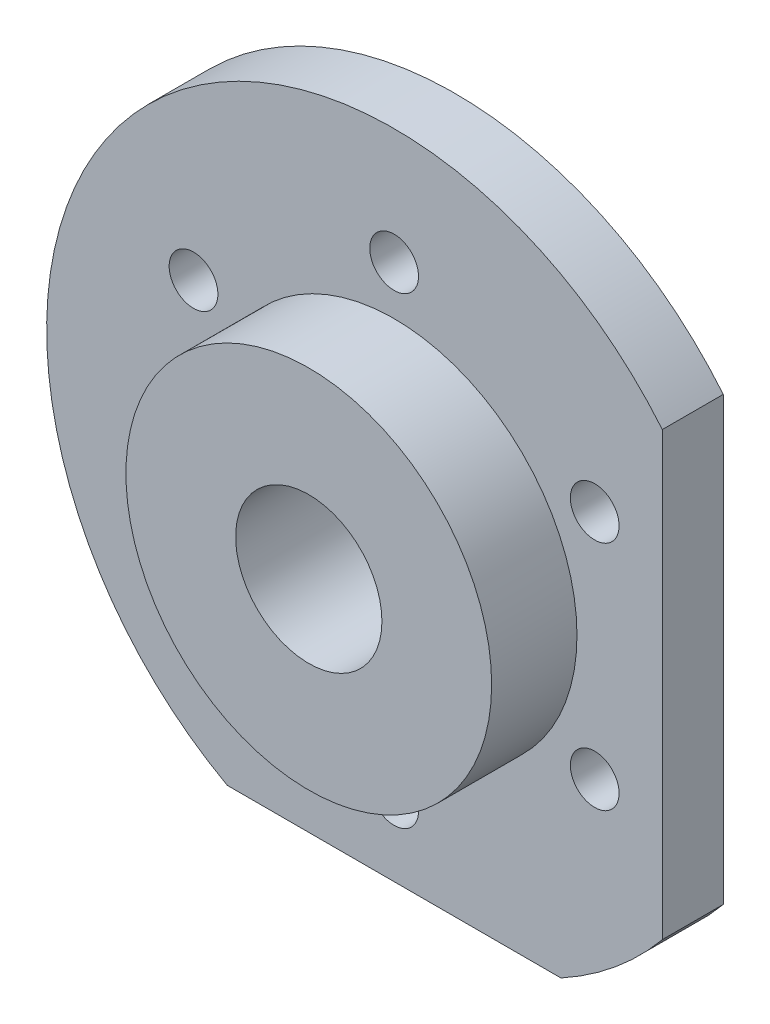
ISO-10303-21;
HEADER;
FILE_DESCRIPTION(('STEP AP214'),'2;1');
FILE_NAME('part.step','',(''),(''),'','','');
FILE_SCHEMA(('AUTOMOTIVE_DESIGN { 1 0 10303 214 1 1 1 1 }'));
ENDSEC;
DATA;
#1=APPLICATION_CONTEXT('core data for automotive mechanical design processes');
#2=APPLICATION_PROTOCOL_DEFINITION('international standard','automotive_design',2000,#1);
#3=PRODUCT_CONTEXT('',#1,'mechanical');
#4=PRODUCT('Part','Part','',(#3));
#5=PRODUCT_RELATED_PRODUCT_CATEGORY('part','',(#4));
#6=PRODUCT_DEFINITION_FORMATION('','',#4);
#7=PRODUCT_DEFINITION_CONTEXT('part definition',#1,'design');
#8=PRODUCT_DEFINITION('design','',#6,#7);
#9=PRODUCT_DEFINITION_SHAPE('','',#8);
#10=(LENGTH_UNIT() NAMED_UNIT(*) SI_UNIT(.MILLI.,.METRE.));
#11=(NAMED_UNIT(*) PLANE_ANGLE_UNIT() SI_UNIT($,.RADIAN.));
#12=(NAMED_UNIT(*) SI_UNIT($,.STERADIAN.) SOLID_ANGLE_UNIT());
#13=UNCERTAINTY_MEASURE_WITH_UNIT(LENGTH_MEASURE(1.E-05),#10,'distance_accuracy_value','');
#14=(GEOMETRIC_REPRESENTATION_CONTEXT(3) GLOBAL_UNCERTAINTY_ASSIGNED_CONTEXT((#13)) GLOBAL_UNIT_ASSIGNED_CONTEXT((#10,
#11,#12)) REPRESENTATION_CONTEXT('',''));
#15=CARTESIAN_POINT('',(0.,0.,0.));
#16=DIRECTION('',(0.,0.,1.));
#17=DIRECTION('',(1.,0.,0.));
#18=AXIS2_PLACEMENT_3D('',#15,#16,#17);
#19=CARTESIAN_POINT('',(0.,-25.,5.));
#20=DIRECTION('',(0.,-1.,0.));
#21=DIRECTION('',(0.,0.,-1.));
#22=AXIS2_PLACEMENT_3D('',#19,#20,#21);
#23=PLANE('',#22);
#24=DIRECTION('',(-1.,0.,0.));
#25=VECTOR('',#24,1.);
#26=CARTESIAN_POINT('',(0.,-25.,0.));
#27=LINE('',#26,#25);
#28=CARTESIAN_POINT('',(13.683932183404,-25.,0.));
#29=VERTEX_POINT('',#28);
#30=CARTESIAN_POINT('',(-13.683932183404,-25.,0.));
#31=VERTEX_POINT('',#30);
#32=EDGE_CURVE('E133',#29,#31,#27,.T.);
#33=ORIENTED_EDGE('',*,*,#32,.F.);
#34=DIRECTION('',(0.,0.,-1.));
#35=VECTOR('',#34,1.);
#36=CARTESIAN_POINT('',(13.683932183404,-25.,5.));
#37=LINE('',#36,#35);
#38=CARTESIAN_POINT('',(13.683932183404,-25.,5.));
#39=VERTEX_POINT('',#38);
#40=EDGE_CURVE('E56',#39,#29,#37,.T.);
#41=ORIENTED_EDGE('',*,*,#40,.F.);
#42=DIRECTION('',(-1.,0.,0.));
#43=VECTOR('',#42,1.);
#44=CARTESIAN_POINT('',(0.,-25.,5.));
#45=LINE('',#44,#43);
#46=CARTESIAN_POINT('',(-13.683932183404,-25.,5.));
#47=VERTEX_POINT('',#46);
#48=EDGE_CURVE('E97',#39,#47,#45,.T.);
#49=ORIENTED_EDGE('',*,*,#48,.T.);
#50=DIRECTION('',(0.,0.,-1.));
#51=VECTOR('',#50,1.);
#52=CARTESIAN_POINT('',(-13.683932183404,-25.,5.));
#53=LINE('',#52,#51);
#54=EDGE_CURVE('E87',#47,#31,#53,.T.);
#55=ORIENTED_EDGE('',*,*,#54,.T.);
#56=EDGE_LOOP('',(#33,#41,#49,#55));
#57=FACE_BOUND('',#56,.T.);
#58=ADVANCED_FACE('F47',(#57),#23,.T.);
#59=CARTESIAN_POINT('',(0.,0.,5.));
#60=DIRECTION('',(0.,0.,-1.));
#61=DIRECTION('',(-1.,0.,0.));
#62=AXIS2_PLACEMENT_3D('',#59,#60,#61);
#63=CYLINDRICAL_SURFACE('',#62,28.5);
#64=CARTESIAN_POINT('',(0.,0.,0.));
#65=DIRECTION('',(0.,0.,1.));
#66=DIRECTION('',(1.,0.,0.));
#67=AXIS2_PLACEMENT_3D('',#64,#65,#66);
#68=CIRCLE('',#67,28.5);
#69=CARTESIAN_POINT('',(22.,-18.1176709319934,0.));
#70=VERTEX_POINT('',#69);
#71=EDGE_CURVE('E104',#29,#70,#68,.T.);
#72=ORIENTED_EDGE('',*,*,#71,.T.);
#73=DIRECTION('',(0.,0.,-1.));
#74=VECTOR('',#73,1.);
#75=CARTESIAN_POINT('',(22.,-18.1176709319934,5.));
#76=LINE('',#75,#74);
#77=CARTESIAN_POINT('',(22.,-18.1176709319934,5.));
#78=VERTEX_POINT('',#77);
#79=EDGE_CURVE('E101',#78,#70,#76,.T.);
#80=ORIENTED_EDGE('',*,*,#79,.F.);
#81=CARTESIAN_POINT('',(0.,0.,5.));
#82=DIRECTION('',(0.,0.,1.));
#83=DIRECTION('',(1.,0.,0.));
#84=AXIS2_PLACEMENT_3D('',#81,#82,#83);
#85=CIRCLE('',#84,28.5);
#86=EDGE_CURVE('E92',#39,#78,#85,.T.);
#87=ORIENTED_EDGE('',*,*,#86,.F.);
#88=ORIENTED_EDGE('',*,*,#40,.T.);
#89=EDGE_LOOP('',(#72,#80,#87,#88));
#90=FACE_BOUND('',#89,.T.);
#91=ADVANCED_FACE('F102',(#90),#63,.T.);
#92=CARTESIAN_POINT('',(22.,0.,5.));
#93=DIRECTION('',(1.,0.,0.));
#94=DIRECTION('',(0.,0.,-1.));
#95=AXIS2_PLACEMENT_3D('',#92,#93,#94);
#96=PLANE('',#95);
#97=DIRECTION('',(0.,-1.,0.));
#98=VECTOR('',#97,1.);
#99=CARTESIAN_POINT('',(22.,0.,0.));
#100=LINE('',#99,#98);
#101=CARTESIAN_POINT('',(22.,18.1176709319934,0.));
#102=VERTEX_POINT('',#101);
#103=EDGE_CURVE('E137',#102,#70,#100,.T.);
#104=ORIENTED_EDGE('',*,*,#103,.F.);
#105=DIRECTION('',(0.,0.,-1.));
#106=VECTOR('',#105,1.);
#107=CARTESIAN_POINT('',(22.,18.1176709319934,5.));
#108=LINE('',#107,#106);
#109=CARTESIAN_POINT('',(22.,18.1176709319934,5.));
#110=VERTEX_POINT('',#109);
#111=EDGE_CURVE('E80',#110,#102,#108,.T.);
#112=ORIENTED_EDGE('',*,*,#111,.F.);
#113=DIRECTION('',(0.,-1.,0.));
#114=VECTOR('',#113,1.);
#115=CARTESIAN_POINT('',(22.,0.,5.));
#116=LINE('',#115,#114);
#117=EDGE_CURVE('E96',#110,#78,#116,.T.);
#118=ORIENTED_EDGE('',*,*,#117,.T.);
#119=ORIENTED_EDGE('',*,*,#79,.T.);
#120=EDGE_LOOP('',(#104,#112,#118,#119));
#121=FACE_BOUND('',#120,.T.);
#122=ADVANCED_FACE('F109',(#121),#96,.T.);
#123=CARTESIAN_POINT('',(0.,19.,5.));
#124=DIRECTION('',(0.,0.,-1.));
#125=DIRECTION('',(-1.,0.,0.));
#126=AXIS2_PLACEMENT_3D('',#123,#124,#125);
#127=CYLINDRICAL_SURFACE('',#126,2.);
#128=CARTESIAN_POINT('',(0.,19.,5.));
#129=DIRECTION('',(0.,0.,1.));
#130=DIRECTION('',(1.,0.,0.));
#131=AXIS2_PLACEMENT_3D('',#128,#129,#130);
#132=CIRCLE('',#131,2.);
#133=CARTESIAN_POINT('',(2.,19.,5.));
#134=VERTEX_POINT('',#133);
#135=EDGE_CURVE('E339',#134,#134,#132,.T.);
#136=ORIENTED_EDGE('',*,*,#135,.T.);
#137=EDGE_LOOP('',(#136));
#138=FACE_BOUND('',#137,.T.);
#139=CARTESIAN_POINT('',(0.,19.,0.));
#140=DIRECTION('',(0.,0.,1.));
#141=DIRECTION('',(1.,0.,0.));
#142=AXIS2_PLACEMENT_3D('',#139,#140,#141);
#143=CIRCLE('',#142,2.);
#144=CARTESIAN_POINT('',(2.,19.,0.));
#145=VERTEX_POINT('',#144);
#146=EDGE_CURVE('E130',#145,#145,#143,.T.);
#147=ORIENTED_EDGE('',*,*,#146,.F.);
#148=EDGE_LOOP('',(#147));
#149=FACE_BOUND('',#148,.T.);
#150=ADVANCED_FACE('F154',(#138,#149),#127,.F.);
#151=CARTESIAN_POINT('',(16.4544826719043,9.50000000000001,5.));
#152=DIRECTION('',(0.,0.,-1.));
#153=DIRECTION('',(-1.,0.,0.));
#154=AXIS2_PLACEMENT_3D('',#151,#152,#153);
#155=CYLINDRICAL_SURFACE('',#154,2.00000000000001);
#156=CARTESIAN_POINT('',(16.4544826719043,9.50000000000001,5.));
#157=DIRECTION('',(0.,0.,1.));
#158=DIRECTION('',(1.,0.,0.));
#159=AXIS2_PLACEMENT_3D('',#156,#157,#158);
#160=CIRCLE('',#159,2.00000000000001);
#161=CARTESIAN_POINT('',(18.4544826719043,9.50000000000001,5.));
#162=VERTEX_POINT('',#161);
#163=EDGE_CURVE('E336',#162,#162,#160,.T.);
#164=ORIENTED_EDGE('',*,*,#163,.T.);
#165=EDGE_LOOP('',(#164));
#166=FACE_BOUND('',#165,.T.);
#167=CARTESIAN_POINT('',(16.4544826719043,9.50000000000001,0.));
#168=DIRECTION('',(0.,0.,1.));
#169=DIRECTION('',(1.,0.,0.));
#170=AXIS2_PLACEMENT_3D('',#167,#168,#169);
#171=CIRCLE('',#170,2.00000000000001);
#172=CARTESIAN_POINT('',(18.4544826719043,9.50000000000001,0.));
#173=VERTEX_POINT('',#172);
#174=EDGE_CURVE('E127',#173,#173,#171,.T.);
#175=ORIENTED_EDGE('',*,*,#174,.F.);
#176=EDGE_LOOP('',(#175));
#177=FACE_BOUND('',#176,.T.);
#178=ADVANCED_FACE('F157',(#166,#177),#155,.F.);
#179=CARTESIAN_POINT('',(16.4544826719043,-9.5,5.));
#180=DIRECTION('',(0.,0.,-1.));
#181=DIRECTION('',(-1.,0.,0.));
#182=AXIS2_PLACEMENT_3D('',#179,#180,#181);
#183=CYLINDRICAL_SURFACE('',#182,2.);
#184=CARTESIAN_POINT('',(16.4544826719043,-9.5,5.));
#185=DIRECTION('',(0.,0.,1.));
#186=DIRECTION('',(1.,0.,0.));
#187=AXIS2_PLACEMENT_3D('',#184,#185,#186);
#188=CIRCLE('',#187,2.);
#189=CARTESIAN_POINT('',(18.4544826719043,-9.5,5.));
#190=VERTEX_POINT('',#189);
#191=EDGE_CURVE('E333',#190,#190,#188,.T.);
#192=ORIENTED_EDGE('',*,*,#191,.T.);
#193=EDGE_LOOP('',(#192));
#194=FACE_BOUND('',#193,.T.);
#195=CARTESIAN_POINT('',(16.4544826719043,-9.5,0.));
#196=DIRECTION('',(0.,0.,1.));
#197=DIRECTION('',(1.,0.,0.));
#198=AXIS2_PLACEMENT_3D('',#195,#196,#197);
#199=CIRCLE('',#198,2.);
#200=CARTESIAN_POINT('',(18.4544826719043,-9.5,0.));
#201=VERTEX_POINT('',#200);
#202=EDGE_CURVE('E124',#201,#201,#199,.T.);
#203=ORIENTED_EDGE('',*,*,#202,.F.);
#204=EDGE_LOOP('',(#203));
#205=FACE_BOUND('',#204,.T.);
#206=ADVANCED_FACE('F161',(#194,#205),#183,.F.);
#207=CARTESIAN_POINT('',(0.,-19.,5.));
#208=DIRECTION('',(0.,0.,-1.));
#209=DIRECTION('',(-1.,0.,0.));
#210=AXIS2_PLACEMENT_3D('',#207,#208,#209);
#211=CYLINDRICAL_SURFACE('',#210,2.);
#212=CARTESIAN_POINT('',(0.,-19.,5.));
#213=DIRECTION('',(0.,0.,1.));
#214=DIRECTION('',(1.,0.,0.));
#215=AXIS2_PLACEMENT_3D('',#212,#213,#214);
#216=CIRCLE('',#215,2.);
#217=CARTESIAN_POINT('',(2.,-19.,5.));
#218=VERTEX_POINT('',#217);
#219=EDGE_CURVE('E330',#218,#218,#216,.T.);
#220=ORIENTED_EDGE('',*,*,#219,.T.);
#221=EDGE_LOOP('',(#220));
#222=FACE_BOUND('',#221,.T.);
#223=CARTESIAN_POINT('',(0.,-19.,0.));
#224=DIRECTION('',(0.,0.,1.));
#225=DIRECTION('',(1.,0.,0.));
#226=AXIS2_PLACEMENT_3D('',#223,#224,#225);
#227=CIRCLE('',#226,2.);
#228=CARTESIAN_POINT('',(2.,-19.,0.));
#229=VERTEX_POINT('',#228);
#230=EDGE_CURVE('E121',#229,#229,#227,.T.);
#231=ORIENTED_EDGE('',*,*,#230,.F.);
#232=EDGE_LOOP('',(#231));
#233=FACE_BOUND('',#232,.T.);
#234=ADVANCED_FACE('F165',(#222,#233),#211,.F.);
#235=CARTESIAN_POINT('',(-16.4544826719043,-9.50000000000001,5.));
#236=DIRECTION('',(0.,0.,-1.));
#237=DIRECTION('',(-1.,0.,0.));
#238=AXIS2_PLACEMENT_3D('',#235,#236,#237);
#239=CYLINDRICAL_SURFACE('',#238,2.);
#240=CARTESIAN_POINT('',(-16.4544826719043,-9.50000000000001,5.));
#241=DIRECTION('',(0.,0.,1.));
#242=DIRECTION('',(1.,0.,0.));
#243=AXIS2_PLACEMENT_3D('',#240,#241,#242);
#244=CIRCLE('',#243,2.);
#245=CARTESIAN_POINT('',(-14.4544826719043,-9.50000000000001,5.));
#246=VERTEX_POINT('',#245);
#247=EDGE_CURVE('E180',#246,#246,#244,.T.);
#248=ORIENTED_EDGE('',*,*,#247,.T.);
#249=EDGE_LOOP('',(#248));
#250=FACE_BOUND('',#249,.T.);
#251=CARTESIAN_POINT('',(-16.4544826719043,-9.50000000000001,0.));
#252=DIRECTION('',(0.,0.,1.));
#253=DIRECTION('',(1.,0.,0.));
#254=AXIS2_PLACEMENT_3D('',#251,#252,#253);
#255=CIRCLE('',#254,2.);
#256=CARTESIAN_POINT('',(-14.4544826719043,-9.50000000000001,0.));
#257=VERTEX_POINT('',#256);
#258=EDGE_CURVE('E117',#257,#257,#255,.T.);
#259=ORIENTED_EDGE('',*,*,#258,.F.);
#260=EDGE_LOOP('',(#259));
#261=FACE_BOUND('',#260,.T.);
#262=ADVANCED_FACE('F168',(#250,#261),#239,.F.);
#263=CARTESIAN_POINT('',(-16.4544826719043,9.49999999999999,5.));
#264=DIRECTION('',(0.,0.,-1.));
#265=DIRECTION('',(-1.,0.,0.));
#266=AXIS2_PLACEMENT_3D('',#263,#264,#265);
#267=CYLINDRICAL_SURFACE('',#266,2.);
#268=CARTESIAN_POINT('',(-16.4544826719043,9.49999999999999,5.));
#269=DIRECTION('',(0.,0.,1.));
#270=DIRECTION('',(1.,0.,0.));
#271=AXIS2_PLACEMENT_3D('',#268,#269,#270);
#272=CIRCLE('',#271,2.);
#273=CARTESIAN_POINT('',(-14.4544826719043,9.49999999999999,5.));
#274=VERTEX_POINT('',#273);
#275=EDGE_CURVE('E141',#274,#274,#272,.T.);
#276=ORIENTED_EDGE('',*,*,#275,.T.);
#277=EDGE_LOOP('',(#276));
#278=FACE_BOUND('',#277,.T.);
#279=CARTESIAN_POINT('',(-16.4544826719043,9.49999999999999,0.));
#280=DIRECTION('',(0.,0.,1.));
#281=DIRECTION('',(1.,0.,0.));
#282=AXIS2_PLACEMENT_3D('',#279,#280,#281);
#283=CIRCLE('',#282,2.);
#284=CARTESIAN_POINT('',(-14.4544826719043,9.49999999999999,0.));
#285=VERTEX_POINT('',#284);
#286=EDGE_CURVE('E114',#285,#285,#283,.T.);
#287=ORIENTED_EDGE('',*,*,#286,.F.);
#288=EDGE_LOOP('',(#287));
#289=FACE_BOUND('',#288,.T.);
#290=ADVANCED_FACE('F49',(#278,#289),#267,.F.);
#291=CARTESIAN_POINT('',(0.,0.,5.));
#292=DIRECTION('',(0.,0.,-1.));
#293=DIRECTION('',(-1.,0.,0.));
#294=AXIS2_PLACEMENT_3D('',#291,#292,#293);
#295=CYLINDRICAL_SURFACE('',#294,28.5);
#296=CARTESIAN_POINT('',(0.,0.,0.));
#297=DIRECTION('',(0.,0.,1.));
#298=DIRECTION('',(1.,0.,0.));
#299=AXIS2_PLACEMENT_3D('',#296,#297,#298);
#300=CIRCLE('',#299,28.5);
#301=EDGE_CURVE('E139',#102,#31,#300,.T.);
#302=ORIENTED_EDGE('',*,*,#301,.T.);
#303=ORIENTED_EDGE('',*,*,#54,.F.);
#304=CARTESIAN_POINT('',(0.,0.,5.));
#305=DIRECTION('',(0.,0.,1.));
#306=DIRECTION('',(1.,0.,0.));
#307=AXIS2_PLACEMENT_3D('',#304,#305,#306);
#308=CIRCLE('',#307,28.5);
#309=EDGE_CURVE('E64',#110,#47,#308,.T.);
#310=ORIENTED_EDGE('',*,*,#309,.F.);
#311=ORIENTED_EDGE('',*,*,#111,.T.);
#312=EDGE_LOOP('',(#302,#303,#310,#311));
#313=FACE_BOUND('',#312,.T.);
#314=ADVANCED_FACE('F175',(#313),#295,.T.);
#315=CARTESIAN_POINT('',(0.,0.,5.));
#316=DIRECTION('',(0.,0.,1.));
#317=DIRECTION('',(1.,0.,0.));
#318=AXIS2_PLACEMENT_3D('',#315,#316,#317);
#319=PLANE('',#318);
#320=ORIENTED_EDGE('',*,*,#275,.F.);
#321=EDGE_LOOP('',(#320));
#322=FACE_BOUND('',#321,.T.);
#323=ORIENTED_EDGE('',*,*,#247,.F.);
#324=EDGE_LOOP('',(#323));
#325=FACE_BOUND('',#324,.T.);
#326=ORIENTED_EDGE('',*,*,#219,.F.);
#327=EDGE_LOOP('',(#326));
#328=FACE_BOUND('',#327,.T.);
#329=ORIENTED_EDGE('',*,*,#191,.F.);
#330=EDGE_LOOP('',(#329));
#331=FACE_BOUND('',#330,.T.);
#332=ORIENTED_EDGE('',*,*,#163,.F.);
#333=EDGE_LOOP('',(#332));
#334=FACE_BOUND('',#333,.T.);
#335=ORIENTED_EDGE('',*,*,#135,.F.);
#336=EDGE_LOOP('',(#335));
#337=FACE_BOUND('',#336,.T.);
#338=CARTESIAN_POINT('',(0.,0.,5.));
#339=DIRECTION('',(0.,0.,1.));
#340=DIRECTION('',(1.,0.,0.));
#341=AXIS2_PLACEMENT_3D('',#338,#339,#340);
#342=CIRCLE('',#341,15.);
#343=CARTESIAN_POINT('',(15.,0.,5.));
#344=VERTEX_POINT('',#343);
#345=EDGE_CURVE('E342',#344,#344,#342,.T.);
#346=ORIENTED_EDGE('',*,*,#345,.F.);
#347=EDGE_LOOP('',(#346));
#348=FACE_BOUND('',#347,.T.);
#349=ORIENTED_EDGE('',*,*,#48,.F.);
#350=ORIENTED_EDGE('',*,*,#86,.T.);
#351=ORIENTED_EDGE('',*,*,#117,.F.);
#352=ORIENTED_EDGE('',*,*,#309,.T.);
#353=EDGE_LOOP('',(#349,#350,#351,#352));
#354=FACE_BOUND('',#353,.T.);
#355=ADVANCED_FACE('F94',(#322,#325,#328,#331,#334,#337,#348,#354),#319,.T.);
#356=CARTESIAN_POINT('',(0.,0.,0.));
#357=DIRECTION('',(0.,0.,1.));
#358=DIRECTION('',(1.,0.,0.));
#359=AXIS2_PLACEMENT_3D('',#356,#357,#358);
#360=PLANE('',#359);
#361=ORIENTED_EDGE('',*,*,#286,.T.);
#362=EDGE_LOOP('',(#361));
#363=FACE_BOUND('',#362,.T.);
#364=ORIENTED_EDGE('',*,*,#258,.T.);
#365=EDGE_LOOP('',(#364));
#366=FACE_BOUND('',#365,.T.);
#367=ORIENTED_EDGE('',*,*,#230,.T.);
#368=EDGE_LOOP('',(#367));
#369=FACE_BOUND('',#368,.T.);
#370=ORIENTED_EDGE('',*,*,#202,.T.);
#371=EDGE_LOOP('',(#370));
#372=FACE_BOUND('',#371,.T.);
#373=ORIENTED_EDGE('',*,*,#174,.T.);
#374=EDGE_LOOP('',(#373));
#375=FACE_BOUND('',#374,.T.);
#376=ORIENTED_EDGE('',*,*,#146,.T.);
#377=EDGE_LOOP('',(#376));
#378=FACE_BOUND('',#377,.T.);
#379=ORIENTED_EDGE('',*,*,#32,.T.);
#380=ORIENTED_EDGE('',*,*,#301,.F.);
#381=ORIENTED_EDGE('',*,*,#103,.T.);
#382=ORIENTED_EDGE('',*,*,#71,.F.);
#383=EDGE_LOOP('',(#379,#380,#381,#382));
#384=FACE_BOUND('',#383,.T.);
#385=CARTESIAN_POINT('',(0.,0.,0.));
#386=DIRECTION('',(0.,0.,1.));
#387=DIRECTION('',(1.,0.,0.));
#388=AXIS2_PLACEMENT_3D('',#385,#386,#387);
#389=CIRCLE('',#388,4.);
#390=CARTESIAN_POINT('',(4.,0.,0.));
#391=VERTEX_POINT('',#390);
#392=EDGE_CURVE('E323',#391,#391,#389,.T.);
#393=ORIENTED_EDGE('',*,*,#392,.T.);
#394=EDGE_LOOP('',(#393));
#395=FACE_BOUND('',#394,.T.);
#396=ADVANCED_FACE('F144',(#363,#366,#369,#372,#375,#378,#384,#395),#360,.F.);
#397=CARTESIAN_POINT('',(0.,0.,12.));
#398=DIRECTION('',(0.,0.,-1.));
#399=DIRECTION('',(-1.,0.,0.));
#400=AXIS2_PLACEMENT_3D('',#397,#398,#399);
#401=CYLINDRICAL_SURFACE('',#400,6.);
#402=CARTESIAN_POINT('',(0.,0.,2.));
#403=DIRECTION('',(0.,0.,1.));
#404=DIRECTION('',(1.,0.,0.));
#405=AXIS2_PLACEMENT_3D('',#402,#403,#404);
#406=CIRCLE('',#405,6.);
#407=CARTESIAN_POINT('',(6.,0.,2.));
#408=VERTEX_POINT('',#407);
#409=EDGE_CURVE('E12',#408,#408,#406,.T.);
#410=ORIENTED_EDGE('',*,*,#409,.F.);
#411=EDGE_LOOP('',(#410));
#412=FACE_BOUND('',#411,.T.);
#413=CARTESIAN_POINT('',(0.,0.,12.));
#414=DIRECTION('',(0.,0.,1.));
#415=DIRECTION('',(1.,0.,0.));
#416=AXIS2_PLACEMENT_3D('',#413,#414,#415);
#417=CIRCLE('',#416,6.);
#418=CARTESIAN_POINT('',(6.,0.,12.));
#419=VERTEX_POINT('',#418);
#420=EDGE_CURVE('E319',#419,#419,#417,.T.);
#421=ORIENTED_EDGE('',*,*,#420,.T.);
#422=EDGE_LOOP('',(#421));
#423=FACE_BOUND('',#422,.T.);
#424=ADVANCED_FACE('F185',(#412,#423),#401,.F.);
#425=CARTESIAN_POINT('',(0.,0.,12.));
#426=DIRECTION('',(0.,0.,-1.));
#427=DIRECTION('',(-1.,0.,0.));
#428=AXIS2_PLACEMENT_3D('',#425,#426,#427);
#429=CYLINDRICAL_SURFACE('',#428,15.);
#430=ORIENTED_EDGE('',*,*,#345,.T.);
#431=EDGE_LOOP('',(#430));
#432=FACE_BOUND('',#431,.T.);
#433=CARTESIAN_POINT('',(0.,0.,12.));
#434=DIRECTION('',(0.,0.,1.));
#435=DIRECTION('',(1.,0.,0.));
#436=AXIS2_PLACEMENT_3D('',#433,#434,#435);
#437=CIRCLE('',#436,15.);
#438=CARTESIAN_POINT('',(15.,0.,12.));
#439=VERTEX_POINT('',#438);
#440=EDGE_CURVE('E118',#439,#439,#437,.T.);
#441=ORIENTED_EDGE('',*,*,#440,.F.);
#442=EDGE_LOOP('',(#441));
#443=FACE_BOUND('',#442,.T.);
#444=ADVANCED_FACE('F203',(#432,#443),#429,.T.);
#445=CARTESIAN_POINT('',(0.,0.,12.));
#446=DIRECTION('',(0.,0.,1.));
#447=DIRECTION('',(1.,0.,0.));
#448=AXIS2_PLACEMENT_3D('',#445,#446,#447);
#449=PLANE('',#448);
#450=ORIENTED_EDGE('',*,*,#420,.F.);
#451=EDGE_LOOP('',(#450));
#452=FACE_BOUND('',#451,.T.);
#453=ORIENTED_EDGE('',*,*,#440,.T.);
#454=EDGE_LOOP('',(#453));
#455=FACE_BOUND('',#454,.T.);
#456=ADVANCED_FACE('F263',(#452,#455),#449,.T.);
#457=CARTESIAN_POINT('',(0.,0.,2.));
#458=DIRECTION('',(0.,0.,-1.));
#459=DIRECTION('',(-1.,0.,0.));
#460=AXIS2_PLACEMENT_3D('',#457,#458,#459);
#461=CYLINDRICAL_SURFACE('',#460,4.);
#462=CARTESIAN_POINT('',(0.,0.,2.));
#463=DIRECTION('',(0.,0.,1.));
#464=DIRECTION('',(1.,0.,0.));
#465=AXIS2_PLACEMENT_3D('',#462,#463,#464);
#466=CIRCLE('',#465,4.);
#467=CARTESIAN_POINT('',(4.,0.,2.));
#468=VERTEX_POINT('',#467);
#469=EDGE_CURVE('E314',#468,#468,#466,.T.);
#470=ORIENTED_EDGE('',*,*,#469,.T.);
#471=EDGE_LOOP('',(#470));
#472=FACE_BOUND('',#471,.T.);
#473=ORIENTED_EDGE('',*,*,#392,.F.);
#474=EDGE_LOOP('',(#473));
#475=FACE_BOUND('',#474,.T.);
#476=ADVANCED_FACE('F274',(#472,#475),#461,.F.);
#477=CARTESIAN_POINT('',(0.,0.,2.));
#478=DIRECTION('',(0.,0.,1.));
#479=DIRECTION('',(1.,0.,0.));
#480=AXIS2_PLACEMENT_3D('',#477,#478,#479);
#481=PLANE('',#480);
#482=ORIENTED_EDGE('',*,*,#469,.F.);
#483=EDGE_LOOP('',(#482));
#484=FACE_BOUND('',#483,.T.);
#485=ORIENTED_EDGE('',*,*,#409,.T.);
#486=EDGE_LOOP('',(#485));
#487=FACE_BOUND('',#486,.T.);
#488=ADVANCED_FACE('F297',(#484,#487),#481,.T.);
#489=CLOSED_SHELL('',(#58,#91,#122,#150,#178,#206,#234,#262,#290,#314,#355,#396,#424,#444,#456,
#476,#488));
#490=MANIFOLD_SOLID_BREP('B2',#489);
#491=CARTESIAN_POINT('',(0.,0.,-1.));
#492=DIRECTION('',(0.,0.,1.));
#493=DIRECTION('',(1.,0.,0.));
#494=AXIS2_PLACEMENT_3D('',#491,#492,#493);
#495=CYLINDRICAL_SURFACE('',#494,15.);
#496=CARTESIAN_POINT('',(0.,0.,-1.));
#497=DIRECTION('',(0.,0.,1.));
#498=DIRECTION('',(1.,0.,0.));
#499=AXIS2_PLACEMENT_3D('',#496,#497,#498);
#500=CIRCLE('',#499,15.);
#501=CARTESIAN_POINT('',(15.,0.,-1.));
#502=VERTEX_POINT('',#501);
#503=EDGE_CURVE('E399',#502,#502,#500,.T.);
#504=ORIENTED_EDGE('',*,*,#503,.T.);
#505=EDGE_LOOP('',(#504));
#506=FACE_BOUND('',#505,.T.);
#507=CARTESIAN_POINT('',(0.,0.,0.));
#508=DIRECTION('',(0.,0.,1.));
#509=DIRECTION('',(1.,0.,0.));
#510=AXIS2_PLACEMENT_3D('',#507,#508,#509);
#511=CIRCLE('',#510,15.);
#512=CARTESIAN_POINT('',(15.,0.,0.));
#513=VERTEX_POINT('',#512);
#514=EDGE_CURVE('E405',#513,#513,#511,.T.);
#515=ORIENTED_EDGE('',*,*,#514,.F.);
#516=EDGE_LOOP('',(#515));
#517=FACE_BOUND('',#516,.T.);
#518=ADVANCED_FACE('F392',(#506,#517),#495,.T.);
#519=CARTESIAN_POINT('',(0.,0.,-1.));
#520=DIRECTION('',(0.,0.,1.));
#521=DIRECTION('',(1.,0.,0.));
#522=AXIS2_PLACEMENT_3D('',#519,#520,#521);
#523=CYLINDRICAL_SURFACE('',#522,4.);
#524=CARTESIAN_POINT('',(0.,0.,-1.));
#525=DIRECTION('',(0.,0.,1.));
#526=DIRECTION('',(1.,0.,0.));
#527=AXIS2_PLACEMENT_3D('',#524,#525,#526);
#528=CIRCLE('',#527,4.);
#529=CARTESIAN_POINT('',(4.,0.,-1.));
#530=VERTEX_POINT('',#529);
#531=EDGE_CURVE('E46',#530,#530,#528,.T.);
#532=ORIENTED_EDGE('',*,*,#531,.F.);
#533=EDGE_LOOP('',(#532));
#534=FACE_BOUND('',#533,.T.);
#535=CARTESIAN_POINT('',(0.,0.,0.));
#536=DIRECTION('',(0.,0.,1.));
#537=DIRECTION('',(1.,0.,0.));
#538=AXIS2_PLACEMENT_3D('',#535,#536,#537);
#539=CIRCLE('',#538,4.);
#540=CARTESIAN_POINT('',(4.,0.,0.));
#541=VERTEX_POINT('',#540);
#542=EDGE_CURVE('E395',#541,#541,#539,.T.);
#543=ORIENTED_EDGE('',*,*,#542,.T.);
#544=EDGE_LOOP('',(#543));
#545=FACE_BOUND('',#544,.T.);
#546=ADVANCED_FACE('F412',(#534,#545),#523,.F.);
#547=CARTESIAN_POINT('',(0.,0.,-1.));
#548=DIRECTION('',(0.,0.,1.));
#549=DIRECTION('',(1.,0.,0.));
#550=AXIS2_PLACEMENT_3D('',#547,#548,#549);
#551=PLANE('',#550);
#552=ORIENTED_EDGE('',*,*,#503,.F.);
#553=EDGE_LOOP('',(#552));
#554=FACE_BOUND('',#553,.T.);
#555=ORIENTED_EDGE('',*,*,#531,.T.);
#556=EDGE_LOOP('',(#555));
#557=FACE_BOUND('',#556,.T.);
#558=ADVANCED_FACE('F416',(#554,#557),#551,.F.);
#559=CARTESIAN_POINT('',(0.,0.,0.));
#560=DIRECTION('',(0.,0.,1.));
#561=DIRECTION('',(1.,0.,0.));
#562=AXIS2_PLACEMENT_3D('',#559,#560,#561);
#563=PLANE('',#562);
#564=ORIENTED_EDGE('',*,*,#514,.T.);
#565=EDGE_LOOP('',(#564));
#566=FACE_BOUND('',#565,.T.);
#567=ORIENTED_EDGE('',*,*,#542,.F.);
#568=EDGE_LOOP('',(#567));
#569=FACE_BOUND('',#568,.T.);
#570=ADVANCED_FACE('F414',(#566,#569),#563,.T.);
#571=CLOSED_SHELL('',(#518,#546,#558,#570));
#572=MANIFOLD_SOLID_BREP('B6',#571);
#573=ADVANCED_BREP_SHAPE_REPRESENTATION('',(#18,#490,#572),#14);
#574=SHAPE_DEFINITION_REPRESENTATION(#9,#573);
ENDSEC;
END-ISO-10303-21;
